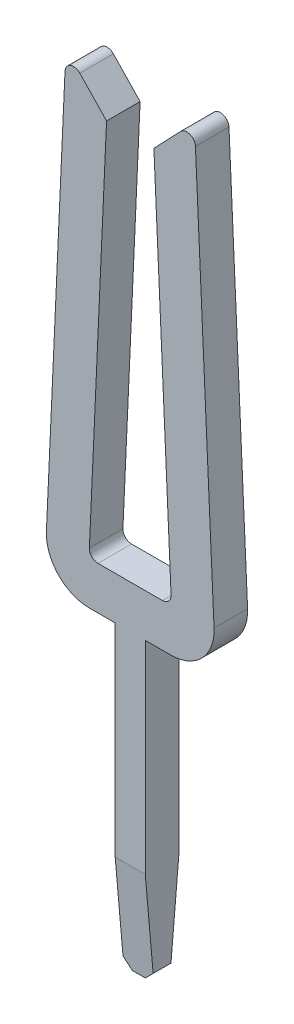
ISO-10303-21;
HEADER;
FILE_DESCRIPTION(('STEP AP214'),'2;1');
FILE_NAME('part.step','',(''),(''),'','','');
FILE_SCHEMA(('AUTOMOTIVE_DESIGN { 1 0 10303 214 1 1 1 1 }'));
ENDSEC;
DATA;
#1=APPLICATION_CONTEXT('core data for automotive mechanical design processes');
#2=APPLICATION_PROTOCOL_DEFINITION('international standard','automotive_design',2000,#1);
#3=PRODUCT_CONTEXT('',#1,'mechanical');
#4=PRODUCT('Part','Part','',(#3));
#5=PRODUCT_RELATED_PRODUCT_CATEGORY('part','',(#4));
#6=PRODUCT_DEFINITION_FORMATION('','',#4);
#7=PRODUCT_DEFINITION_CONTEXT('part definition',#1,'design');
#8=PRODUCT_DEFINITION('design','',#6,#7);
#9=PRODUCT_DEFINITION_SHAPE('','',#8);
#10=(LENGTH_UNIT() NAMED_UNIT(*) SI_UNIT(.MILLI.,.METRE.));
#11=(NAMED_UNIT(*) PLANE_ANGLE_UNIT() SI_UNIT($,.RADIAN.));
#12=(NAMED_UNIT(*) SI_UNIT($,.STERADIAN.) SOLID_ANGLE_UNIT());
#13=UNCERTAINTY_MEASURE_WITH_UNIT(LENGTH_MEASURE(1.E-05),#10,'distance_accuracy_value','');
#14=(GEOMETRIC_REPRESENTATION_CONTEXT(3) GLOBAL_UNCERTAINTY_ASSIGNED_CONTEXT((#13)) GLOBAL_UNIT_ASSIGNED_CONTEXT((#10,
#11,#12)) REPRESENTATION_CONTEXT('',''));
#15=CARTESIAN_POINT('',(0.,0.,0.));
#16=DIRECTION('',(0.,0.,1.));
#17=DIRECTION('',(1.,0.,0.));
#18=AXIS2_PLACEMENT_3D('',#15,#16,#17);
#19=CARTESIAN_POINT('',(-10.8182880257158,4.76078327336471,0.195));
#20=DIRECTION('',(0.,0.,1.));
#21=DIRECTION('',(1.,0.,0.));
#22=AXIS2_PLACEMENT_3D('',#19,#20,#21);
#23=PLANE('',#22);
#24=CARTESIAN_POINT('',(-10.8182880257158,4.76078327336471,0.195));
#25=DIRECTION('',(0.,0.,1.));
#26=DIRECTION('',(1.,0.,0.));
#27=AXIS2_PLACEMENT_3D('',#24,#25,#26);
#28=CIRCLE('',#27,0.0999999999997548);
#29=CARTESIAN_POINT('',(-10.9181841851492,4.76533929469887,0.195));
#30=VERTEX_POINT('',#29);
#31=CARTESIAN_POINT('',(-10.745991311125,4.82987151447223,0.195));
#32=VERTEX_POINT('',#31);
#33=EDGE_CURVE('E329',#30,#32,#28,.F.);
#34=ORIENTED_EDGE('',*,*,#33,.F.);
#35=DIRECTION('',(-0.0455602133417506,-0.998961594336967,0.));
#36=VECTOR('',#35,1.);
#37=CARTESIAN_POINT('',(-10.9181841851492,4.76533929469887,0.195));
#38=LINE('',#37,#36);
#39=CARTESIAN_POINT('',(-11.1344807971685,0.0227801066708819,0.195));
#40=VERTEX_POINT('',#39);
#41=EDGE_CURVE('E235',#40,#30,#38,.F.);
#42=ORIENTED_EDGE('',*,*,#41,.F.);
#43=CARTESIAN_POINT('',(-10.635,0.,0.195));
#44=DIRECTION('',(0.,0.,1.));
#45=DIRECTION('',(1.,0.,0.));
#46=AXIS2_PLACEMENT_3D('',#43,#44,#45);
#47=CIRCLE('',#46,0.500000000000007);
#48=CARTESIAN_POINT('',(-10.635,-0.500000000000001,0.195));
#49=VERTEX_POINT('',#48);
#50=EDGE_CURVE('E326',#49,#40,#47,.F.);
#51=ORIENTED_EDGE('',*,*,#50,.F.);
#52=DIRECTION('',(1.,0.,0.));
#53=VECTOR('',#52,1.);
#54=CARTESIAN_POINT('',(-10.635,-0.500000000000001,0.195));
#55=LINE('',#54,#53);
#56=CARTESIAN_POINT('',(-10.335,-0.500000000000001,0.195));
#57=VERTEX_POINT('',#56);
#58=EDGE_CURVE('E212',#57,#49,#55,.F.);
#59=ORIENTED_EDGE('',*,*,#58,.F.);
#60=DIRECTION('',(0.,-1.,0.));
#61=VECTOR('',#60,1.);
#62=CARTESIAN_POINT('',(-10.335,-0.500000000000001,0.195));
#63=LINE('',#62,#61);
#64=CARTESIAN_POINT('',(-10.335,-2.85699476972389,0.194999999999997));
#65=VERTEX_POINT('',#64);
#66=EDGE_CURVE('E215',#65,#57,#63,.F.);
#67=ORIENTED_EDGE('',*,*,#66,.F.);
#68=DIRECTION('',(1.,0.,0.));
#69=VECTOR('',#68,1.);
#70=CARTESIAN_POINT('',(-10.8182880257158,-2.85699476972384,0.194999999999999));
#71=LINE('',#70,#69);
#72=CARTESIAN_POINT('',(-9.985,-2.85699476972378,0.195000000000002));
#73=VERTEX_POINT('',#72);
#74=EDGE_CURVE('E230',#65,#73,#71,.T.);
#75=ORIENTED_EDGE('',*,*,#74,.T.);
#76=DIRECTION('',(0.,1.,0.));
#77=VECTOR('',#76,1.);
#78=CARTESIAN_POINT('',(-9.985,-0.500000000000001,0.195));
#79=LINE('',#78,#77);
#80=CARTESIAN_POINT('',(-9.985,-0.500000000000001,0.195));
#81=VERTEX_POINT('',#80);
#82=EDGE_CURVE('E174',#81,#73,#79,.F.);
#83=ORIENTED_EDGE('',*,*,#82,.F.);
#84=DIRECTION('',(1.,0.,0.));
#85=VECTOR('',#84,1.);
#86=CARTESIAN_POINT('',(-9.685,-0.500000000000001,0.195));
#87=LINE('',#86,#85);
#88=CARTESIAN_POINT('',(-9.685,-0.500000000000001,0.195));
#89=VERTEX_POINT('',#88);
#90=EDGE_CURVE('E172',#89,#81,#87,.F.);
#91=ORIENTED_EDGE('',*,*,#90,.F.);
#92=CARTESIAN_POINT('',(-9.685,0.,0.195));
#93=DIRECTION('',(0.,0.,1.));
#94=DIRECTION('',(1.,0.,0.));
#95=AXIS2_PLACEMENT_3D('',#92,#93,#94);
#96=CIRCLE('',#95,0.500000000000007);
#97=CARTESIAN_POINT('',(-9.18551920283151,0.0227801066708834,0.195));
#98=VERTEX_POINT('',#97);
#99=EDGE_CURVE('E20',#98,#89,#96,.F.);
#100=ORIENTED_EDGE('',*,*,#99,.F.);
#101=DIRECTION('',(-0.0455602133417508,0.998961594336967,0.));
#102=VECTOR('',#101,1.);
#103=CARTESIAN_POINT('',(-9.40181581485076,4.76533929469887,0.195));
#104=LINE('',#103,#102);
#105=CARTESIAN_POINT('',(-9.40181581485076,4.76533929469887,0.195));
#106=VERTEX_POINT('',#105);
#107=EDGE_CURVE('E271',#106,#98,#104,.F.);
#108=ORIENTED_EDGE('',*,*,#107,.F.);
#109=CARTESIAN_POINT('',(-9.50171197428421,4.76078327336471,0.195));
#110=DIRECTION('',(0.,0.,1.));
#111=DIRECTION('',(1.,0.,0.));
#112=AXIS2_PLACEMENT_3D('',#109,#110,#111);
#113=CIRCLE('',#112,0.0999999999997548);
#114=CARTESIAN_POINT('',(-9.574008688875,4.82987151447223,0.195));
#115=VERTEX_POINT('',#114);
#116=EDGE_CURVE('E335',#115,#106,#113,.F.);
#117=ORIENTED_EDGE('',*,*,#116,.F.);
#118=DIRECTION('',(-0.690882411076866,-0.722967145909561,0.));
#119=VECTOR('',#118,1.);
#120=CARTESIAN_POINT('',(-9.88490577385959,4.50453629881292,0.195));
#121=LINE('',#120,#119);
#122=CARTESIAN_POINT('',(-9.88490577385958,4.50453629881292,0.195));
#123=VERTEX_POINT('',#122);
#124=EDGE_CURVE('E265',#123,#115,#121,.F.);
#125=ORIENTED_EDGE('',*,*,#124,.F.);
#126=DIRECTION('',(0.045362988129247,-0.998970569790715,0.));
#127=VECTOR('',#126,1.);
#128=CARTESIAN_POINT('',(-9.68510294302093,0.104536298812924,0.195));
#129=LINE('',#128,#127);
#130=CARTESIAN_POINT('',(-9.68510294302093,0.104536298812924,0.195));
#131=VERTEX_POINT('',#130);
#132=EDGE_CURVE('E258',#131,#123,#129,.F.);
#133=ORIENTED_EDGE('',*,*,#132,.F.);
#134=CARTESIAN_POINT('',(-9.785,0.0999999999999989,0.195));
#135=DIRECTION('',(0.,0.,1.));
#136=DIRECTION('',(1.,0.,0.));
#137=AXIS2_PLACEMENT_3D('',#134,#135,#136);
#138=CIRCLE('',#137,0.0999999999999994);
#139=CARTESIAN_POINT('',(-9.785,0.,0.195));
#140=VERTEX_POINT('',#139);
#141=EDGE_CURVE('E334',#131,#140,#138,.F.);
#142=ORIENTED_EDGE('',*,*,#141,.T.);
#143=DIRECTION('',(-1.,0.,0.));
#144=VECTOR('',#143,1.);
#145=CARTESIAN_POINT('',(-10.535,0.,0.195));
#146=LINE('',#145,#144);
#147=CARTESIAN_POINT('',(-10.535,0.,0.195));
#148=VERTEX_POINT('',#147);
#149=EDGE_CURVE('E253',#148,#140,#146,.F.);
#150=ORIENTED_EDGE('',*,*,#149,.F.);
#151=CARTESIAN_POINT('',(-10.535,0.0999999999999988,0.195));
#152=DIRECTION('',(0.,0.,1.));
#153=DIRECTION('',(1.,0.,0.));
#154=AXIS2_PLACEMENT_3D('',#151,#152,#153);
#155=CIRCLE('',#154,0.0999999999999994);
#156=CARTESIAN_POINT('',(-10.6348970569791,0.104536298812923,0.195));
#157=VERTEX_POINT('',#156);
#158=EDGE_CURVE('E332',#148,#157,#155,.F.);
#159=ORIENTED_EDGE('',*,*,#158,.T.);
#160=DIRECTION('',(0.0453629881292467,0.998970569790715,0.));
#161=VECTOR('',#160,1.);
#162=CARTESIAN_POINT('',(-10.6348970569791,0.104536298812923,0.195));
#163=LINE('',#162,#161);
#164=CARTESIAN_POINT('',(-10.4350942261404,4.50453629881292,0.195));
#165=VERTEX_POINT('',#164);
#166=EDGE_CURVE('E247',#165,#157,#163,.F.);
#167=ORIENTED_EDGE('',*,*,#166,.F.);
#168=DIRECTION('',(-0.690882411076866,0.722967145909561,0.));
#169=VECTOR('',#168,1.);
#170=CARTESIAN_POINT('',(-10.4350942261404,4.50453629881292,0.195));
#171=LINE('',#170,#169);
#172=EDGE_CURVE('E240',#32,#165,#171,.F.);
#173=ORIENTED_EDGE('',*,*,#172,.F.);
#174=EDGE_LOOP('',(#34,#42,#51,#59,#67,#75,#83,#91,#100,#108,#117,#125,#133,#142,#150,#159,#167,#173));
#175=FACE_BOUND('',#174,.T.);
#176=ADVANCED_FACE('F17',(#175),#23,.T.);
#177=CARTESIAN_POINT('',(-10.8182880257158,-2.85699476972383,0.195));
#178=DIRECTION('',(0.,0.0871557427476551,-0.996194698091746));
#179=DIRECTION('',(0.,0.996194698091746,0.0871557427476551));
#180=AXIS2_PLACEMENT_3D('',#177,#178,#179);
#181=PLANE('',#180);
#182=DIRECTION('',(-0.705757556807952,-0.705757556807952,-0.0617457854184467));
#183=VECTOR('',#182,1.);
#184=CARTESIAN_POINT('',(-9.985,-3.90000000000159,0.103748866352454));
#185=LINE('',#184,#183);
#186=CARTESIAN_POINT('',(-9.985,-3.90000000000159,0.103748866352454));
#187=VERTEX_POINT('',#186);
#188=CARTESIAN_POINT('',(-10.0849999999984,-4.00000000000001,0.095));
#189=VERTEX_POINT('',#188);
#190=EDGE_CURVE('E280',#187,#189,#185,.T.);
#191=ORIENTED_EDGE('',*,*,#190,.F.);
#192=DIRECTION('',(0.,-0.996194698091746,-0.0871557427476547));
#193=VECTOR('',#192,1.);
#194=CARTESIAN_POINT('',(-9.985,-2.85699476972382,0.195));
#195=LINE('',#194,#193);
#196=EDGE_CURVE('E205',#73,#187,#195,.T.);
#197=ORIENTED_EDGE('',*,*,#196,.F.);
#198=ORIENTED_EDGE('',*,*,#74,.F.);
#199=DIRECTION('',(0.,0.996194698091746,0.0871557427476555));
#200=VECTOR('',#199,1.);
#201=CARTESIAN_POINT('',(-10.335,-3.90000000000159,0.103748866352454));
#202=LINE('',#201,#200);
#203=CARTESIAN_POINT('',(-10.335,-3.90000000000159,0.103748866352454));
#204=VERTEX_POINT('',#203);
#205=EDGE_CURVE('E223',#204,#65,#202,.T.);
#206=ORIENTED_EDGE('',*,*,#205,.F.);
#207=DIRECTION('',(-0.705757556807954,0.70575755680795,0.0617457854184468));
#208=VECTOR('',#207,1.);
#209=CARTESIAN_POINT('',(-10.2350000000016,-4.00000000000001,0.095));
#210=LINE('',#209,#208);
#211=CARTESIAN_POINT('',(-10.2350000000016,-4.00000000000001,0.0949999999999999));
#212=VERTEX_POINT('',#211);
#213=EDGE_CURVE('E282',#212,#204,#210,.T.);
#214=ORIENTED_EDGE('',*,*,#213,.F.);
#215=DIRECTION('',(1.,0.,0.));
#216=VECTOR('',#215,1.);
#217=CARTESIAN_POINT('',(-10.2350000000016,-4.00000000000001,0.0949999999999999));
#218=LINE('',#217,#216);
#219=EDGE_CURVE('E232',#189,#212,#218,.F.);
#220=ORIENTED_EDGE('',*,*,#219,.F.);
#221=EDGE_LOOP('',(#191,#197,#198,#206,#214,#220));
#222=FACE_BOUND('',#221,.T.);
#223=ADVANCED_FACE('F633',(#222),#181,.F.);
#224=CARTESIAN_POINT('',(-10.2350000000016,-4.00000000000001,-0.195));
#225=DIRECTION('',(0.,-1.,0.));
#226=DIRECTION('',(0.,0.,-1.));
#227=AXIS2_PLACEMENT_3D('',#224,#225,#226);
#228=PLANE('',#227);
#229=DIRECTION('',(0.,0.,1.));
#230=VECTOR('',#229,1.);
#231=CARTESIAN_POINT('',(-10.2350000000016,-4.00000000000001,-0.195));
#232=LINE('',#231,#230);
#233=CARTESIAN_POINT('',(-10.2350000000016,-4.00000000000001,-0.0949999999999998));
#234=VERTEX_POINT('',#233);
#235=EDGE_CURVE('E289',#234,#212,#232,.T.);
#236=ORIENTED_EDGE('',*,*,#235,.F.);
#237=DIRECTION('',(1.,0.,0.));
#238=VECTOR('',#237,1.);
#239=CARTESIAN_POINT('',(-10.2350000000016,-4.00000000000001,-0.0949999999999998));
#240=LINE('',#239,#238);
#241=CARTESIAN_POINT('',(-10.0849999999984,-4.00000000000001,-0.0949999999999998));
#242=VERTEX_POINT('',#241);
#243=EDGE_CURVE('E226',#242,#234,#240,.F.);
#244=ORIENTED_EDGE('',*,*,#243,.F.);
#245=DIRECTION('',(0.,0.,1.));
#246=VECTOR('',#245,1.);
#247=CARTESIAN_POINT('',(-10.0849999999984,-4.00000000000001,-0.195));
#248=LINE('',#247,#246);
#249=EDGE_CURVE('E277',#189,#242,#248,.F.);
#250=ORIENTED_EDGE('',*,*,#249,.F.);
#251=ORIENTED_EDGE('',*,*,#219,.T.);
#252=EDGE_LOOP('',(#236,#244,#250,#251));
#253=FACE_BOUND('',#252,.T.);
#254=ADVANCED_FACE('F623',(#253),#228,.T.);
#255=CARTESIAN_POINT('',(-10.335,-3.90000000000159,-0.195));
#256=DIRECTION('',(-0.707106781186547,-0.707106781186548,0.));
#257=DIRECTION('',(0.707106781186548,-0.707106781186547,0.));
#258=AXIS2_PLACEMENT_3D('',#255,#256,#257);
#259=PLANE('',#258);
#260=DIRECTION('',(0.,0.,1.));
#261=VECTOR('',#260,1.);
#262=CARTESIAN_POINT('',(-10.335,-3.90000000000159,-0.195));
#263=LINE('',#262,#261);
#264=CARTESIAN_POINT('',(-10.335,-3.90000000000159,-0.103748866352454));
#265=VERTEX_POINT('',#264);
#266=EDGE_CURVE('E227',#265,#204,#263,.T.);
#267=ORIENTED_EDGE('',*,*,#266,.F.);
#268=DIRECTION('',(-0.705757556807944,0.70575755680796,-0.0617457854184476));
#269=VECTOR('',#268,1.);
#270=CARTESIAN_POINT('',(-10.2350000000016,-4.00000000000001,-0.0949999999999999));
#271=LINE('',#270,#269);
#272=EDGE_CURVE('E374',#234,#265,#271,.T.);
#273=ORIENTED_EDGE('',*,*,#272,.F.);
#274=ORIENTED_EDGE('',*,*,#235,.T.);
#275=ORIENTED_EDGE('',*,*,#213,.T.);
#276=EDGE_LOOP('',(#267,#273,#274,#275));
#277=FACE_BOUND('',#276,.T.);
#278=ADVANCED_FACE('F613',(#277),#259,.T.);
#279=CARTESIAN_POINT('',(-9.985,-3.90000000000159,-0.195));
#280=DIRECTION('',(0.707106781186547,-0.707106781186548,0.));
#281=DIRECTION('',(0.707106781186548,0.707106781186547,0.));
#282=AXIS2_PLACEMENT_3D('',#279,#280,#281);
#283=PLANE('',#282);
#284=ORIENTED_EDGE('',*,*,#249,.T.);
#285=DIRECTION('',(-0.705757556807947,-0.705757556807957,0.0617457854184473));
#286=VECTOR('',#285,1.);
#287=CARTESIAN_POINT('',(-9.985,-3.90000000000159,-0.103748866352454));
#288=LINE('',#287,#286);
#289=CARTESIAN_POINT('',(-9.985,-3.90000000000159,-0.103748866352454));
#290=VERTEX_POINT('',#289);
#291=EDGE_CURVE('E194',#290,#242,#288,.T.);
#292=ORIENTED_EDGE('',*,*,#291,.F.);
#293=DIRECTION('',(0.,0.,1.));
#294=VECTOR('',#293,1.);
#295=CARTESIAN_POINT('',(-9.985,-3.90000000000159,-0.195));
#296=LINE('',#295,#294);
#297=EDGE_CURVE('E188',#187,#290,#296,.F.);
#298=ORIENTED_EDGE('',*,*,#297,.F.);
#299=ORIENTED_EDGE('',*,*,#190,.T.);
#300=EDGE_LOOP('',(#284,#292,#298,#299));
#301=FACE_BOUND('',#300,.T.);
#302=ADVANCED_FACE('F603',(#301),#283,.T.);
#303=CARTESIAN_POINT('',(-9.985,-0.500000000000001,-0.195));
#304=DIRECTION('',(1.,0.,0.));
#305=DIRECTION('',(0.,1.,0.));
#306=AXIS2_PLACEMENT_3D('',#303,#304,#305);
#307=PLANE('',#306);
#308=DIRECTION('',(0.,1.,0.));
#309=VECTOR('',#308,1.);
#310=CARTESIAN_POINT('',(-9.985,4.76078327336471,-0.195));
#311=LINE('',#310,#309);
#312=CARTESIAN_POINT('',(-9.985,-2.85699476972381,-0.195000000000001));
#313=VERTEX_POINT('',#312);
#314=CARTESIAN_POINT('',(-9.985,-0.500000000000001,-0.195));
#315=VERTEX_POINT('',#314);
#316=EDGE_CURVE('E191',#313,#315,#311,.T.);
#317=ORIENTED_EDGE('',*,*,#316,.T.);
#318=DIRECTION('',(0.,0.,-1.));
#319=VECTOR('',#318,1.);
#320=CARTESIAN_POINT('',(-9.985,-0.500000000000001,-0.195));
#321=LINE('',#320,#319);
#322=EDGE_CURVE('E177',#81,#315,#321,.T.);
#323=ORIENTED_EDGE('',*,*,#322,.F.);
#324=ORIENTED_EDGE('',*,*,#82,.T.);
#325=ORIENTED_EDGE('',*,*,#196,.T.);
#326=ORIENTED_EDGE('',*,*,#297,.T.);
#327=DIRECTION('',(0.,0.996194698091746,-0.0871557427476551));
#328=VECTOR('',#327,1.);
#329=CARTESIAN_POINT('',(-9.985,-4.00000000000001,-0.0949999999999999));
#330=LINE('',#329,#328);
#331=EDGE_CURVE('E197',#313,#290,#330,.F.);
#332=ORIENTED_EDGE('',*,*,#331,.F.);
#333=EDGE_LOOP('',(#317,#323,#324,#325,#326,#332));
#334=FACE_BOUND('',#333,.T.);
#335=ADVANCED_FACE('F594',(#334),#307,.T.);
#336=CARTESIAN_POINT('',(-9.685,-0.500000000000001,-0.195));
#337=DIRECTION('',(0.,-1.,0.));
#338=DIRECTION('',(0.,0.,-1.));
#339=AXIS2_PLACEMENT_3D('',#336,#337,#338);
#340=PLANE('',#339);
#341=DIRECTION('',(0.,0.,1.));
#342=VECTOR('',#341,1.);
#343=CARTESIAN_POINT('',(-9.685,-0.500000000000001,-0.195));
#344=LINE('',#343,#342);
#345=CARTESIAN_POINT('',(-9.685,-0.500000000000001,-0.195));
#346=VERTEX_POINT('',#345);
#347=EDGE_CURVE('E167',#89,#346,#344,.F.);
#348=ORIENTED_EDGE('',*,*,#347,.F.);
#349=ORIENTED_EDGE('',*,*,#90,.T.);
#350=ORIENTED_EDGE('',*,*,#322,.T.);
#351=DIRECTION('',(1.,0.,0.));
#352=VECTOR('',#351,1.);
#353=CARTESIAN_POINT('',(-10.8182880257158,-0.500000000000001,-0.195));
#354=LINE('',#353,#352);
#355=EDGE_CURVE('E182',#315,#346,#354,.T.);
#356=ORIENTED_EDGE('',*,*,#355,.T.);
#357=EDGE_LOOP('',(#348,#349,#350,#356));
#358=FACE_BOUND('',#357,.T.);
#359=ADVANCED_FACE('F180',(#358),#340,.T.);
#360=CARTESIAN_POINT('',(-9.685,0.,-0.195));
#361=DIRECTION('',(0.,0.,1.));
#362=DIRECTION('',(1.,0.,0.));
#363=AXIS2_PLACEMENT_3D('',#360,#361,#362);
#364=CYLINDRICAL_SURFACE('',#363,0.500000000000007);
#365=DIRECTION('',(0.,0.,1.));
#366=VECTOR('',#365,1.);
#367=CARTESIAN_POINT('',(-9.18551920283151,0.0227801066708831,-0.195));
#368=LINE('',#367,#366);
#369=CARTESIAN_POINT('',(-9.18551920283151,0.0227801066708826,-0.195));
#370=VERTEX_POINT('',#369);
#371=EDGE_CURVE('E170',#98,#370,#368,.F.);
#372=ORIENTED_EDGE('',*,*,#371,.F.);
#373=ORIENTED_EDGE('',*,*,#99,.T.);
#374=ORIENTED_EDGE('',*,*,#347,.T.);
#375=CARTESIAN_POINT('',(-9.685,0.,-0.195));
#376=DIRECTION('',(0.,0.,1.));
#377=DIRECTION('',(1.,0.,0.));
#378=AXIS2_PLACEMENT_3D('',#375,#376,#377);
#379=CIRCLE('',#378,0.500000000000007);
#380=EDGE_CURVE('E324',#346,#370,#379,.T.);
#381=ORIENTED_EDGE('',*,*,#380,.T.);
#382=EDGE_LOOP('',(#372,#373,#374,#381));
#383=FACE_BOUND('',#382,.T.);
#384=ADVANCED_FACE('F165',(#383),#364,.T.);
#385=CARTESIAN_POINT('',(-9.40181581485076,4.76533929469887,-0.195));
#386=DIRECTION('',(0.998961594336967,0.0455602133417508,0.));
#387=DIRECTION('',(-0.0455602133417508,0.998961594336967,0.));
#388=AXIS2_PLACEMENT_3D('',#385,#386,#387);
#389=PLANE('',#388);
#390=DIRECTION('',(0.,0.,1.));
#391=VECTOR('',#390,1.);
#392=CARTESIAN_POINT('',(-9.40181581485076,4.76533929469887,-0.195));
#393=LINE('',#392,#391);
#394=CARTESIAN_POINT('',(-9.40181581485076,4.76533929469887,-0.195));
#395=VERTEX_POINT('',#394);
#396=EDGE_CURVE('E272',#106,#395,#393,.F.);
#397=ORIENTED_EDGE('',*,*,#396,.F.);
#398=ORIENTED_EDGE('',*,*,#107,.T.);
#399=ORIENTED_EDGE('',*,*,#371,.T.);
#400=DIRECTION('',(-0.045560213341751,0.998961594336967,0.));
#401=VECTOR('',#400,1.);
#402=CARTESIAN_POINT('',(-9.18551920283151,0.0227801066708822,-0.195));
#403=LINE('',#402,#401);
#404=EDGE_CURVE('E323',#370,#395,#403,.T.);
#405=ORIENTED_EDGE('',*,*,#404,.T.);
#406=EDGE_LOOP('',(#397,#398,#399,#405));
#407=FACE_BOUND('',#406,.T.);
#408=ADVANCED_FACE('F451',(#407),#389,.T.);
#409=CARTESIAN_POINT('',(-9.50171197428421,4.76078327336471,-0.195));
#410=DIRECTION('',(0.,0.,1.));
#411=DIRECTION('',(1.,0.,0.));
#412=AXIS2_PLACEMENT_3D('',#409,#410,#411);
#413=CYLINDRICAL_SURFACE('',#412,0.0999999999997548);
#414=DIRECTION('',(0.,0.,1.));
#415=VECTOR('',#414,1.);
#416=CARTESIAN_POINT('',(-9.574008688875,4.82987151447223,-0.195));
#417=LINE('',#416,#415);
#418=CARTESIAN_POINT('',(-9.57400868887499,4.82987151447223,-0.195));
#419=VERTEX_POINT('',#418);
#420=EDGE_CURVE('E268',#115,#419,#417,.F.);
#421=ORIENTED_EDGE('',*,*,#420,.F.);
#422=ORIENTED_EDGE('',*,*,#116,.T.);
#423=ORIENTED_EDGE('',*,*,#396,.T.);
#424=CARTESIAN_POINT('',(-9.50171197428421,4.76078327336471,-0.195));
#425=DIRECTION('',(0.,0.,1.));
#426=DIRECTION('',(1.,0.,0.));
#427=AXIS2_PLACEMENT_3D('',#424,#425,#426);
#428=CIRCLE('',#427,0.0999999999997548);
#429=EDGE_CURVE('E319',#395,#419,#428,.T.);
#430=ORIENTED_EDGE('',*,*,#429,.T.);
#431=EDGE_LOOP('',(#421,#422,#423,#430));
#432=FACE_BOUND('',#431,.T.);
#433=ADVANCED_FACE('F449',(#432),#413,.T.);
#434=CARTESIAN_POINT('',(-9.88490577385959,4.50453629881292,-0.195));
#435=DIRECTION('',(-0.722967145909561,0.690882411076866,0.));
#436=DIRECTION('',(-0.690882411076866,-0.722967145909561,0.));
#437=AXIS2_PLACEMENT_3D('',#434,#435,#436);
#438=PLANE('',#437);
#439=DIRECTION('',(0.,0.,1.));
#440=VECTOR('',#439,1.);
#441=CARTESIAN_POINT('',(-9.88490577385958,4.50453629881292,-0.195));
#442=LINE('',#441,#440);
#443=CARTESIAN_POINT('',(-9.88490577385958,4.50453629881292,-0.195));
#444=VERTEX_POINT('',#443);
#445=EDGE_CURVE('E262',#123,#444,#442,.F.);
#446=ORIENTED_EDGE('',*,*,#445,.F.);
#447=ORIENTED_EDGE('',*,*,#124,.T.);
#448=ORIENTED_EDGE('',*,*,#420,.T.);
#449=DIRECTION('',(-0.690882411076866,-0.722967145909561,0.));
#450=VECTOR('',#449,1.);
#451=CARTESIAN_POINT('',(-9.57400868887499,4.82987151447223,-0.195));
#452=LINE('',#451,#450);
#453=EDGE_CURVE('E322',#419,#444,#452,.T.);
#454=ORIENTED_EDGE('',*,*,#453,.T.);
#455=EDGE_LOOP('',(#446,#447,#448,#454));
#456=FACE_BOUND('',#455,.T.);
#457=ADVANCED_FACE('F447',(#456),#438,.T.);
#458=CARTESIAN_POINT('',(-9.68510294302093,0.104536298812924,-0.195));
#459=DIRECTION('',(-0.998970569790715,-0.045362988129247,0.));
#460=DIRECTION('',(0.045362988129247,-0.998970569790715,0.));
#461=AXIS2_PLACEMENT_3D('',#458,#459,#460);
#462=PLANE('',#461);
#463=DIRECTION('',(0.,0.,1.));
#464=VECTOR('',#463,1.);
#465=CARTESIAN_POINT('',(-9.68510294302093,0.104536298812923,-0.195));
#466=LINE('',#465,#464);
#467=CARTESIAN_POINT('',(-9.68510294302093,0.104536298812923,-0.195));
#468=VERTEX_POINT('',#467);
#469=EDGE_CURVE('E261',#468,#131,#466,.T.);
#470=ORIENTED_EDGE('',*,*,#469,.T.);
#471=ORIENTED_EDGE('',*,*,#132,.T.);
#472=ORIENTED_EDGE('',*,*,#445,.T.);
#473=DIRECTION('',(0.0453629881292472,-0.998970569790715,0.));
#474=VECTOR('',#473,1.);
#475=CARTESIAN_POINT('',(-9.88490577385958,4.50453629881292,-0.195));
#476=LINE('',#475,#474);
#477=EDGE_CURVE('E318',#444,#468,#476,.T.);
#478=ORIENTED_EDGE('',*,*,#477,.T.);
#479=EDGE_LOOP('',(#470,#471,#472,#478));
#480=FACE_BOUND('',#479,.T.);
#481=ADVANCED_FACE('F444',(#480),#462,.T.);
#482=CARTESIAN_POINT('',(-9.785,0.0999999999999989,-0.195));
#483=DIRECTION('',(0.,0.,1.));
#484=DIRECTION('',(1.,0.,0.));
#485=AXIS2_PLACEMENT_3D('',#482,#483,#484);
#486=CYLINDRICAL_SURFACE('',#485,0.0999999999999994);
#487=CARTESIAN_POINT('',(-9.785,0.0999999999999989,-0.195));
#488=DIRECTION('',(0.,0.,1.));
#489=DIRECTION('',(1.,0.,0.));
#490=AXIS2_PLACEMENT_3D('',#487,#488,#489);
#491=CIRCLE('',#490,0.0999999999999994);
#492=CARTESIAN_POINT('',(-9.785,0.,-0.195));
#493=VERTEX_POINT('',#492);
#494=EDGE_CURVE('E316',#468,#493,#491,.F.);
#495=ORIENTED_EDGE('',*,*,#494,.T.);
#496=DIRECTION('',(0.,0.,1.));
#497=VECTOR('',#496,1.);
#498=CARTESIAN_POINT('',(-9.785,0.,-0.195));
#499=LINE('',#498,#497);
#500=EDGE_CURVE('E257',#140,#493,#499,.F.);
#501=ORIENTED_EDGE('',*,*,#500,.F.);
#502=ORIENTED_EDGE('',*,*,#141,.F.);
#503=ORIENTED_EDGE('',*,*,#469,.F.);
#504=EDGE_LOOP('',(#495,#501,#502,#503));
#505=FACE_BOUND('',#504,.T.);
#506=ADVANCED_FACE('F439',(#505),#486,.F.);
#507=CARTESIAN_POINT('',(-10.535,0.,-0.195));
#508=DIRECTION('',(0.,1.,0.));
#509=DIRECTION('',(-1.,0.,0.));
#510=AXIS2_PLACEMENT_3D('',#507,#508,#509);
#511=PLANE('',#510);
#512=DIRECTION('',(0.,0.,1.));
#513=VECTOR('',#512,1.);
#514=CARTESIAN_POINT('',(-10.535,0.,-0.195));
#515=LINE('',#514,#513);
#516=CARTESIAN_POINT('',(-10.535,0.,-0.195));
#517=VERTEX_POINT('',#516);
#518=EDGE_CURVE('E256',#517,#148,#515,.T.);
#519=ORIENTED_EDGE('',*,*,#518,.T.);
#520=ORIENTED_EDGE('',*,*,#149,.T.);
#521=ORIENTED_EDGE('',*,*,#500,.T.);
#522=DIRECTION('',(1.,0.,0.));
#523=VECTOR('',#522,1.);
#524=CARTESIAN_POINT('',(-10.8182880257158,0.,-0.195));
#525=LINE('',#524,#523);
#526=EDGE_CURVE('E315',#493,#517,#525,.F.);
#527=ORIENTED_EDGE('',*,*,#526,.T.);
#528=EDGE_LOOP('',(#519,#520,#521,#527));
#529=FACE_BOUND('',#528,.T.);
#530=ADVANCED_FACE('F436',(#529),#511,.T.);
#531=CARTESIAN_POINT('',(-10.535,0.0999999999999988,-0.195));
#532=DIRECTION('',(0.,0.,1.));
#533=DIRECTION('',(1.,0.,0.));
#534=AXIS2_PLACEMENT_3D('',#531,#532,#533);
#535=CYLINDRICAL_SURFACE('',#534,0.0999999999999994);
#536=ORIENTED_EDGE('',*,*,#518,.F.);
#537=CARTESIAN_POINT('',(-10.535,0.0999999999999988,-0.195));
#538=DIRECTION('',(0.,0.,1.));
#539=DIRECTION('',(1.,0.,0.));
#540=AXIS2_PLACEMENT_3D('',#537,#538,#539);
#541=CIRCLE('',#540,0.0999999999999994);
#542=CARTESIAN_POINT('',(-10.6348970569791,0.104536298812923,-0.195));
#543=VERTEX_POINT('',#542);
#544=EDGE_CURVE('E311',#517,#543,#541,.F.);
#545=ORIENTED_EDGE('',*,*,#544,.T.);
#546=DIRECTION('',(0.,0.,1.));
#547=VECTOR('',#546,1.);
#548=CARTESIAN_POINT('',(-10.6348970569791,0.104536298812923,-0.195));
#549=LINE('',#548,#547);
#550=EDGE_CURVE('E250',#157,#543,#549,.F.);
#551=ORIENTED_EDGE('',*,*,#550,.F.);
#552=ORIENTED_EDGE('',*,*,#158,.F.);
#553=EDGE_LOOP('',(#536,#545,#551,#552));
#554=FACE_BOUND('',#553,.T.);
#555=ADVANCED_FACE('F432',(#554),#535,.F.);
#556=CARTESIAN_POINT('',(-10.6348970569791,0.104536298812923,-0.195));
#557=DIRECTION('',(0.998970569790715,-0.0453629881292467,0.));
#558=DIRECTION('',(0.0453629881292467,0.998970569790715,0.));
#559=AXIS2_PLACEMENT_3D('',#556,#557,#558);
#560=PLANE('',#559);
#561=DIRECTION('',(0.,0.,1.));
#562=VECTOR('',#561,1.);
#563=CARTESIAN_POINT('',(-10.4350942261404,4.50453629881292,-0.195));
#564=LINE('',#563,#562);
#565=CARTESIAN_POINT('',(-10.4350942261404,4.50453629881292,-0.195));
#566=VERTEX_POINT('',#565);
#567=EDGE_CURVE('E244',#165,#566,#564,.F.);
#568=ORIENTED_EDGE('',*,*,#567,.F.);
#569=ORIENTED_EDGE('',*,*,#166,.T.);
#570=ORIENTED_EDGE('',*,*,#550,.T.);
#571=DIRECTION('',(0.0453629881292468,0.998970569790715,0.));
#572=VECTOR('',#571,1.);
#573=CARTESIAN_POINT('',(-10.6348970569791,0.104536298812924,-0.195));
#574=LINE('',#573,#572);
#575=EDGE_CURVE('E314',#543,#566,#574,.T.);
#576=ORIENTED_EDGE('',*,*,#575,.T.);
#577=EDGE_LOOP('',(#568,#569,#570,#576));
#578=FACE_BOUND('',#577,.T.);
#579=ADVANCED_FACE('F428',(#578),#560,.T.);
#580=CARTESIAN_POINT('',(-10.4350942261404,4.50453629881292,-0.195));
#581=DIRECTION('',(0.722967145909561,0.690882411076866,0.));
#582=DIRECTION('',(-0.690882411076866,0.722967145909561,0.));
#583=AXIS2_PLACEMENT_3D('',#580,#581,#582);
#584=PLANE('',#583);
#585=DIRECTION('',(0.,0.,1.));
#586=VECTOR('',#585,1.);
#587=CARTESIAN_POINT('',(-10.745991311125,4.82987151447223,-0.195));
#588=LINE('',#587,#586);
#589=CARTESIAN_POINT('',(-10.745991311125,4.82987151447223,-0.195));
#590=VERTEX_POINT('',#589);
#591=EDGE_CURVE('E243',#32,#590,#588,.F.);
#592=ORIENTED_EDGE('',*,*,#591,.F.);
#593=ORIENTED_EDGE('',*,*,#172,.T.);
#594=ORIENTED_EDGE('',*,*,#567,.T.);
#595=DIRECTION('',(-0.690882411076865,0.722967145909562,0.));
#596=VECTOR('',#595,1.);
#597=CARTESIAN_POINT('',(-10.4350942261404,4.50453629881292,-0.195));
#598=LINE('',#597,#596);
#599=EDGE_CURVE('E310',#566,#590,#598,.T.);
#600=ORIENTED_EDGE('',*,*,#599,.T.);
#601=EDGE_LOOP('',(#592,#593,#594,#600));
#602=FACE_BOUND('',#601,.T.);
#603=ADVANCED_FACE('F423',(#602),#584,.T.);
#604=CARTESIAN_POINT('',(-10.8182880257158,4.76078327336471,-0.195));
#605=DIRECTION('',(0.,0.,1.));
#606=DIRECTION('',(1.,0.,0.));
#607=AXIS2_PLACEMENT_3D('',#604,#605,#606);
#608=CYLINDRICAL_SURFACE('',#607,0.0999999999997548);
#609=DIRECTION('',(0.,0.,1.));
#610=VECTOR('',#609,1.);
#611=CARTESIAN_POINT('',(-10.9181841851492,4.76533929469887,-0.195));
#612=LINE('',#611,#610);
#613=CARTESIAN_POINT('',(-10.9181841851492,4.76533929469887,-0.195));
#614=VERTEX_POINT('',#613);
#615=EDGE_CURVE('E239',#30,#614,#612,.F.);
#616=ORIENTED_EDGE('',*,*,#615,.F.);
#617=ORIENTED_EDGE('',*,*,#33,.T.);
#618=ORIENTED_EDGE('',*,*,#591,.T.);
#619=CARTESIAN_POINT('',(-10.8182880257158,4.76078327336471,-0.195));
#620=DIRECTION('',(0.,0.,1.));
#621=DIRECTION('',(1.,0.,0.));
#622=AXIS2_PLACEMENT_3D('',#619,#620,#621);
#623=CIRCLE('',#622,0.0999999999997548);
#624=EDGE_CURVE('E307',#590,#614,#623,.T.);
#625=ORIENTED_EDGE('',*,*,#624,.T.);
#626=EDGE_LOOP('',(#616,#617,#618,#625));
#627=FACE_BOUND('',#626,.T.);
#628=ADVANCED_FACE('F420',(#627),#608,.T.);
#629=CARTESIAN_POINT('',(-10.9181841851492,4.76533929469887,-0.195));
#630=DIRECTION('',(-0.998961594336967,0.0455602133417506,0.));
#631=DIRECTION('',(-0.0455602133417506,-0.998961594336967,0.));
#632=AXIS2_PLACEMENT_3D('',#629,#630,#631);
#633=PLANE('',#632);
#634=DIRECTION('',(0.,0.,1.));
#635=VECTOR('',#634,1.);
#636=CARTESIAN_POINT('',(-11.1344807971685,0.0227801066708818,-0.195));
#637=LINE('',#636,#635);
#638=CARTESIAN_POINT('',(-11.1344807971685,0.0227801066708819,-0.195));
#639=VERTEX_POINT('',#638);
#640=EDGE_CURVE('E238',#40,#639,#637,.F.);
#641=ORIENTED_EDGE('',*,*,#640,.F.);
#642=ORIENTED_EDGE('',*,*,#41,.T.);
#643=ORIENTED_EDGE('',*,*,#615,.T.);
#644=DIRECTION('',(-0.0455602133417503,-0.998961594336967,0.));
#645=VECTOR('',#644,1.);
#646=CARTESIAN_POINT('',(-10.9181841851492,4.76533929469887,-0.195));
#647=LINE('',#646,#645);
#648=EDGE_CURVE('E306',#614,#639,#647,.T.);
#649=ORIENTED_EDGE('',*,*,#648,.T.);
#650=EDGE_LOOP('',(#641,#642,#643,#649));
#651=FACE_BOUND('',#650,.T.);
#652=ADVANCED_FACE('F415',(#651),#633,.T.);
#653=CARTESIAN_POINT('',(-10.635,0.,-0.195));
#654=DIRECTION('',(0.,0.,1.));
#655=DIRECTION('',(1.,0.,0.));
#656=AXIS2_PLACEMENT_3D('',#653,#654,#655);
#657=CYLINDRICAL_SURFACE('',#656,0.500000000000007);
#658=DIRECTION('',(0.,0.,1.));
#659=VECTOR('',#658,1.);
#660=CARTESIAN_POINT('',(-10.635,-0.500000000000001,-0.195));
#661=LINE('',#660,#659);
#662=CARTESIAN_POINT('',(-10.635,-0.500000000000001,-0.195));
#663=VERTEX_POINT('',#662);
#664=EDGE_CURVE('E216',#49,#663,#661,.F.);
#665=ORIENTED_EDGE('',*,*,#664,.F.);
#666=ORIENTED_EDGE('',*,*,#50,.T.);
#667=ORIENTED_EDGE('',*,*,#640,.T.);
#668=CARTESIAN_POINT('',(-10.635,0.,-0.195));
#669=DIRECTION('',(0.,0.,1.));
#670=DIRECTION('',(1.,0.,0.));
#671=AXIS2_PLACEMENT_3D('',#668,#669,#670);
#672=CIRCLE('',#671,0.500000000000007);
#673=EDGE_CURVE('E302',#639,#663,#672,.T.);
#674=ORIENTED_EDGE('',*,*,#673,.T.);
#675=EDGE_LOOP('',(#665,#666,#667,#674));
#676=FACE_BOUND('',#675,.T.);
#677=ADVANCED_FACE('F412',(#676),#657,.T.);
#678=CARTESIAN_POINT('',(-10.635,-0.500000000000001,-0.195));
#679=DIRECTION('',(0.,-1.,0.));
#680=DIRECTION('',(1.,0.,0.));
#681=AXIS2_PLACEMENT_3D('',#678,#679,#680);
#682=PLANE('',#681);
#683=DIRECTION('',(0.,0.,1.));
#684=VECTOR('',#683,1.);
#685=CARTESIAN_POINT('',(-10.335,-0.500000000000001,-0.195));
#686=LINE('',#685,#684);
#687=CARTESIAN_POINT('',(-10.335,-0.500000000000001,-0.195));
#688=VERTEX_POINT('',#687);
#689=EDGE_CURVE('E220',#57,#688,#686,.F.);
#690=ORIENTED_EDGE('',*,*,#689,.F.);
#691=ORIENTED_EDGE('',*,*,#58,.T.);
#692=ORIENTED_EDGE('',*,*,#664,.T.);
#693=DIRECTION('',(1.,0.,0.));
#694=VECTOR('',#693,1.);
#695=CARTESIAN_POINT('',(-10.8182880257158,-0.500000000000001,-0.195));
#696=LINE('',#695,#694);
#697=EDGE_CURVE('E305',#663,#688,#696,.T.);
#698=ORIENTED_EDGE('',*,*,#697,.T.);
#699=EDGE_LOOP('',(#690,#691,#692,#698));
#700=FACE_BOUND('',#699,.T.);
#701=ADVANCED_FACE('F404',(#700),#682,.T.);
#702=CARTESIAN_POINT('',(-10.335,-0.500000000000001,-0.195));
#703=DIRECTION('',(-1.,0.,0.));
#704=DIRECTION('',(0.,-1.,0.));
#705=AXIS2_PLACEMENT_3D('',#702,#703,#704);
#706=PLANE('',#705);
#707=ORIENTED_EDGE('',*,*,#266,.T.);
#708=ORIENTED_EDGE('',*,*,#205,.T.);
#709=ORIENTED_EDGE('',*,*,#66,.T.);
#710=ORIENTED_EDGE('',*,*,#689,.T.);
#711=DIRECTION('',(0.,1.,0.));
#712=VECTOR('',#711,1.);
#713=CARTESIAN_POINT('',(-10.335,4.76078327336471,-0.195));
#714=LINE('',#713,#712);
#715=CARTESIAN_POINT('',(-10.335,-2.85699476972377,-0.195000000000003));
#716=VERTEX_POINT('',#715);
#717=EDGE_CURVE('E26',#688,#716,#714,.F.);
#718=ORIENTED_EDGE('',*,*,#717,.T.);
#719=DIRECTION('',(0.,0.996194698091746,-0.0871557427476551));
#720=VECTOR('',#719,1.);
#721=CARTESIAN_POINT('',(-10.335,-4.00000000000001,-0.0949999999999999));
#722=LINE('',#721,#720);
#723=EDGE_CURVE('E34',#265,#716,#722,.T.);
#724=ORIENTED_EDGE('',*,*,#723,.F.);
#725=EDGE_LOOP('',(#707,#708,#709,#710,#718,#724));
#726=FACE_BOUND('',#725,.T.);
#727=ADVANCED_FACE('F467',(#726),#706,.T.);
#728=CARTESIAN_POINT('',(-10.2350000000016,-4.00000000000001,-0.0949999999999999));
#729=DIRECTION('',(0.,-0.0871557427476551,-0.996194698091746));
#730=DIRECTION('',(0.,0.996194698091746,-0.0871557427476551));
#731=AXIS2_PLACEMENT_3D('',#728,#729,#730);
#732=PLANE('',#731);
#733=ORIENTED_EDGE('',*,*,#331,.T.);
#734=ORIENTED_EDGE('',*,*,#291,.T.);
#735=ORIENTED_EDGE('',*,*,#243,.T.);
#736=ORIENTED_EDGE('',*,*,#272,.T.);
#737=ORIENTED_EDGE('',*,*,#723,.T.);
#738=DIRECTION('',(1.,0.,0.));
#739=VECTOR('',#738,1.);
#740=CARTESIAN_POINT('',(-10.8182880257158,-2.85699476972381,-0.195));
#741=LINE('',#740,#739);
#742=EDGE_CURVE('E11',#716,#313,#741,.T.);
#743=ORIENTED_EDGE('',*,*,#742,.T.);
#744=EDGE_LOOP('',(#733,#734,#735,#736,#737,#743));
#745=FACE_BOUND('',#744,.T.);
#746=ADVANCED_FACE('F462',(#745),#732,.T.);
#747=CARTESIAN_POINT('',(-10.8182880257158,4.76078327336471,-0.195));
#748=DIRECTION('',(0.,0.,1.));
#749=DIRECTION('',(1.,0.,0.));
#750=AXIS2_PLACEMENT_3D('',#747,#748,#749);
#751=PLANE('',#750);
#752=ORIENTED_EDGE('',*,*,#717,.F.);
#753=ORIENTED_EDGE('',*,*,#697,.F.);
#754=ORIENTED_EDGE('',*,*,#673,.F.);
#755=ORIENTED_EDGE('',*,*,#648,.F.);
#756=ORIENTED_EDGE('',*,*,#624,.F.);
#757=ORIENTED_EDGE('',*,*,#599,.F.);
#758=ORIENTED_EDGE('',*,*,#575,.F.);
#759=ORIENTED_EDGE('',*,*,#544,.F.);
#760=ORIENTED_EDGE('',*,*,#526,.F.);
#761=ORIENTED_EDGE('',*,*,#494,.F.);
#762=ORIENTED_EDGE('',*,*,#477,.F.);
#763=ORIENTED_EDGE('',*,*,#453,.F.);
#764=ORIENTED_EDGE('',*,*,#429,.F.);
#765=ORIENTED_EDGE('',*,*,#404,.F.);
#766=ORIENTED_EDGE('',*,*,#380,.F.);
#767=ORIENTED_EDGE('',*,*,#355,.F.);
#768=ORIENTED_EDGE('',*,*,#316,.F.);
#769=ORIENTED_EDGE('',*,*,#742,.F.);
#770=EDGE_LOOP('',(#752,#753,#754,#755,#756,#757,#758,#759,#760,#761,#762,#763,#764,#765,#766,
#767,#768,#769));
#771=FACE_BOUND('',#770,.T.);
#772=ADVANCED_FACE('F409',(#771),#751,.F.);
#773=CLOSED_SHELL('',(#176,#223,#254,#278,#302,#335,#359,#384,#408,#433,#457,#481,#506,#530,
#555,#579,#603,#628,#652,#677,#701,#727,#746,#772));
#774=MANIFOLD_SOLID_BREP('B1',#773);
#775=ADVANCED_BREP_SHAPE_REPRESENTATION('',(#18,#774),#14);
#776=SHAPE_DEFINITION_REPRESENTATION(#9,#775);
ENDSEC;
END-ISO-10303-21;
